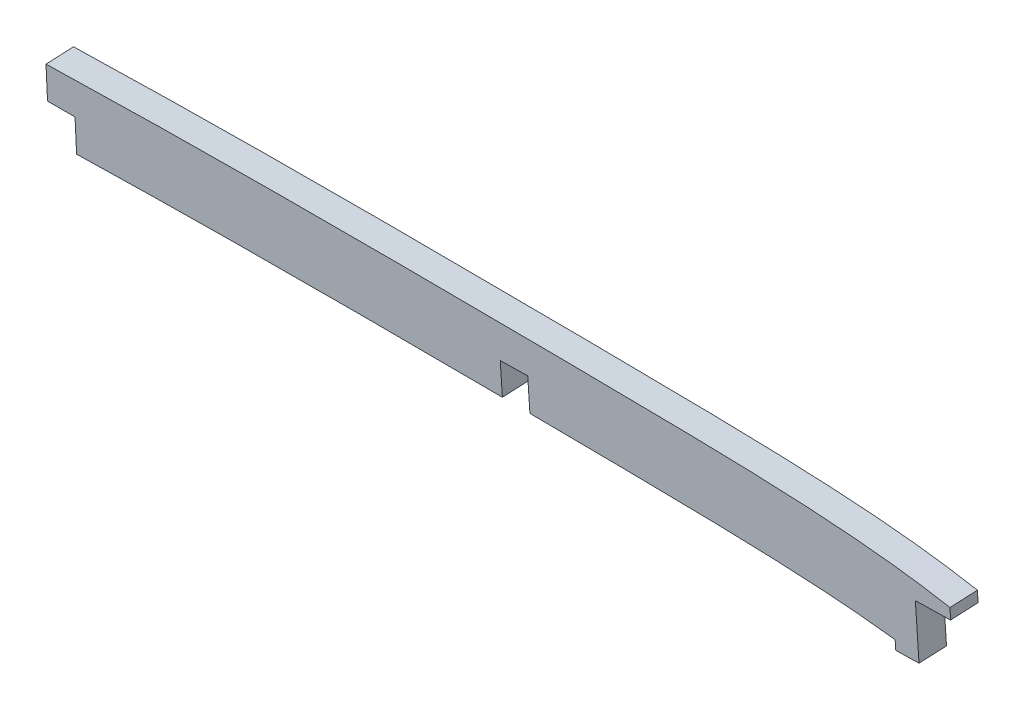
ISO-10303-21;
HEADER;
FILE_DESCRIPTION(('STEP AP214'),'2;1');
FILE_NAME('part.step','',(''),(''),'','','');
FILE_SCHEMA(('AUTOMOTIVE_DESIGN { 1 0 10303 214 1 1 1 1 }'));
ENDSEC;
DATA;
#1=APPLICATION_CONTEXT('core data for automotive mechanical design processes');
#2=APPLICATION_PROTOCOL_DEFINITION('international standard','automotive_design',2000,#1);
#3=PRODUCT_CONTEXT('',#1,'mechanical');
#4=PRODUCT('Part','Part','',(#3));
#5=PRODUCT_RELATED_PRODUCT_CATEGORY('part','',(#4));
#6=PRODUCT_DEFINITION_FORMATION('','',#4);
#7=PRODUCT_DEFINITION_CONTEXT('part definition',#1,'design');
#8=PRODUCT_DEFINITION('design','',#6,#7);
#9=PRODUCT_DEFINITION_SHAPE('','',#8);
#10=(LENGTH_UNIT() NAMED_UNIT(*) SI_UNIT(.MILLI.,.METRE.));
#11=(NAMED_UNIT(*) PLANE_ANGLE_UNIT() SI_UNIT($,.RADIAN.));
#12=(NAMED_UNIT(*) SI_UNIT($,.STERADIAN.) SOLID_ANGLE_UNIT());
#13=UNCERTAINTY_MEASURE_WITH_UNIT(LENGTH_MEASURE(1.E-05),#10,'distance_accuracy_value','');
#14=(GEOMETRIC_REPRESENTATION_CONTEXT(3) GLOBAL_UNCERTAINTY_ASSIGNED_CONTEXT((#13)) GLOBAL_UNIT_ASSIGNED_CONTEXT((#10,
#11,#12)) REPRESENTATION_CONTEXT('',''));
#15=CARTESIAN_POINT('',(0.,0.,0.));
#16=DIRECTION('',(0.,0.,1.));
#17=DIRECTION('',(1.,0.,0.));
#18=AXIS2_PLACEMENT_3D('',#15,#16,#17);
#19=CARTESIAN_POINT('',(369.420487818709,61.2412763168802,-346.422078012425));
#20=CARTESIAN_POINT('',(368.44240568916,61.4320300050019,-346.413164665957));
#21=CARTESIAN_POINT('',(366.486866077233,61.7722987126271,-346.397257008369));
#22=CARTESIAN_POINT('',(362.486782990101,62.3297593061845,-346.371165639694));
#23=CARTESIAN_POINT('',(355.33819907259,63.0165295983064,-346.338938603197));
#24=CARTESIAN_POINT('',(344.775357576126,63.4351211440958,-346.31906275037));
#25=CARTESIAN_POINT('',(331.824438621819,63.6148412933998,-346.310212852813));
#26=CARTESIAN_POINT('',(318.802983299391,63.7288283680356,-346.304419145696));
#27=CARTESIAN_POINT('',(305.794687789378,63.804468488525,-346.300410381191));
#28=CARTESIAN_POINT('',(288.488108246319,63.7992452569213,-346.300002987431));
#29=CARTESIAN_POINT('',(275.548958827054,63.6009343430068,-346.30874493665));
#30=CARTESIAN_POINT('',(266.917257889437,63.3568843264094,-346.319777214006));
#31=B_SPLINE_CURVE_WITH_KNOTS('',3,(#19,#20,#21,#22,#23,#24,#25,#26,#27,#28,#29,#30),
.UNSPECIFIED.,.F.,.F.,(4,1,1,1,1,1,1,1,1,4),(0.,0.0302202493862455,0.0604404987724908,
0.120880997544982,0.241761995089964,0.362642992634945,0.483523990179927,0.604404987724909,
0.725285985269891,0.967047980359854),.UNSPECIFIED.);
#32=DIRECTION('',(3.7543523764589E-05,-0.0464839809289168,0.998919034810872));
#33=VECTOR('',#32,1.);
#34=SURFACE_OF_LINEAR_EXTRUSION('',#31,#33);
#35=CARTESIAN_POINT('',(369.420607019397,61.0936896774308,-343.2505100769));
#36=CARTESIAN_POINT('',(368.442524889848,61.2844433655526,-343.241596730432));
#37=CARTESIAN_POINT('',(366.486985277921,61.6247120731778,-343.225689072844));
#38=CARTESIAN_POINT('',(362.486902190789,62.1821726667352,-343.199597704169));
#39=CARTESIAN_POINT('',(355.338318273278,62.8689429588571,-343.167370667673));
#40=CARTESIAN_POINT('',(344.775476776814,63.2875345046465,-343.147494814846));
#41=CARTESIAN_POINT('',(331.824557822507,63.4672546539505,-343.138644917288));
#42=CARTESIAN_POINT('',(318.803102500079,63.5812417285863,-343.132851210172));
#43=CARTESIAN_POINT('',(305.794806990066,63.6568818490757,-343.128842445667));
#44=CARTESIAN_POINT('',(288.488227447007,63.651658617472,-343.128435051906));
#45=CARTESIAN_POINT('',(275.549078027742,63.4533477035575,-343.137177001126));
#46=CARTESIAN_POINT('',(266.917377090125,63.2092976869601,-343.148209278481));
#47=B_SPLINE_CURVE_WITH_KNOTS('',3,(#35,#36,#37,#38,#39,#40,#41,#42,#43,#44,#45,#46),
.UNSPECIFIED.,.F.,.F.,(4,1,1,1,1,1,1,1,1,4),(0.,0.0302202493862455,0.0604404987724908,
0.120880997544982,0.241761995089964,0.362642992634945,0.483523990179927,0.604404987724909,
0.725285985269891,0.967047980359854),.UNSPECIFIED.);
#48=CARTESIAN_POINT('',(364.250658331424,61.930010134383,-343.211398196056));
#49=VERTEX_POINT('',#48);
#50=CARTESIAN_POINT('',(322.188953932461,63.5488260067344,-343.134486906896));
#51=VERTEX_POINT('',#50);
#52=EDGE_CURVE('E169',#49,#51,#47,.T.);
#53=ORIENTED_EDGE('',*,*,#52,.T.);
#54=DIRECTION('',(-3.75435237647195E-05,0.0464839809289114,-0.998919034810872));
#55=VECTOR('',#54,1.);
#56=CARTESIAN_POINT('',(322.188972537256,63.5257907433447,-342.639469857754));
#57=LINE('',#56,#55);
#58=CARTESIAN_POINT('',(322.188834731773,63.6964126461844,-346.306054842437));
#59=VERTEX_POINT('',#58);
#60=EDGE_CURVE('E327',#51,#59,#57,.T.);
#61=ORIENTED_EDGE('',*,*,#60,.T.);
#62=CARTESIAN_POINT('',(364.250539130736,62.0775967738323,-346.38296613158));
#63=VERTEX_POINT('',#62);
#64=EDGE_CURVE('E141',#63,#59,#31,.T.);
#65=ORIENTED_EDGE('',*,*,#64,.F.);
#66=DIRECTION('',(3.7543523764589E-05,-0.0464839809289168,0.998919034810872));
#67=VECTOR('',#66,1.);
#68=CARTESIAN_POINT('',(364.250539130736,62.0775967738323,-346.38296613158));
#69=LINE('',#68,#67);
#70=EDGE_CURVE('E182',#63,#49,#69,.T.);
#71=ORIENTED_EDGE('',*,*,#70,.T.);
#72=EDGE_LOOP('',(#53,#61,#65,#71));
#73=FACE_BOUND('',#72,.T.);
#74=ADVANCED_FACE('F33',(#73),#34,.F.);
#75=CARTESIAN_POINT('',(266.699880799312,71.0252455411841,-345.962927354164));
#76=CARTESIAN_POINT('',(275.688882980563,71.2793838491713,-345.951439054267));
#77=CARTESIAN_POINT('',(284.67872368024,71.4141313557889,-345.945506551208));
#78=CARTESIAN_POINT('',(302.659729883252,71.4949967987281,-345.942419336663));
#79=CARTESIAN_POINT('',(311.650873909508,71.4495120296195,-345.944873862289));
#80=CARTESIAN_POINT('',(325.137727462551,71.3455825222424,-345.950217039323));
#81=CARTESIAN_POINT('',(329.632952739579,71.3049320735367,-345.952277628027));
#82=CARTESIAN_POINT('',(338.621240842678,71.1905407321223,-345.957938564243));
#83=CARTESIAN_POINT('',(343.114428544064,71.1187107172777,-345.961449995117));
#84=CARTESIAN_POINT('',(349.846717867757,70.8963174700665,-345.972051932768));
#85=CARTESIAN_POINT('',(352.08950535454,70.8021563917662,-345.976517944285));
#86=CARTESIAN_POINT('',(356.570532443114,70.5442411962474,-345.988688258547));
#87=CARTESIAN_POINT('',(358.808776972705,70.3805624856446,-345.996389052486));
#88=CARTESIAN_POINT('',(363.278261116932,69.9460138492462,-346.016778443419));
#89=CARTESIAN_POINT('',(365.509502272778,69.6751675074835,-346.029465943005));
#90=CARTESIAN_POINT('',(369.961608798798,68.9747015794495,-346.062228951284));
#91=CARTESIAN_POINT('',(372.182467437235,68.5449789822166,-346.082309253265));
#92=CARTESIAN_POINT('',(374.395880799313,68.0013266334214,-346.107690914708));
#93=B_SPLINE_CURVE_WITH_KNOTS('',3,(#75,#76,#77,#78,#79,#80,#81,#82,#83,#84,#85,#86,#87,#88,#89,
#90,#91,#92),.UNSPECIFIED.,.F.,.F.,(4,2,2,2,2,2,2,2,4),(0.,0.249999999999999,0.499999999999998,
0.624999999999999,0.749999999999999,0.812499999999999,0.875,0.9375,1.),.UNSPECIFIED.);
#94=DIRECTION('',(3.7543523764589E-05,-0.0464839809289168,0.998919034810872));
#95=VECTOR('',#94,1.);
#96=SURFACE_OF_LINEAR_EXTRUSION('',#93,#95);
#97=CARTESIAN_POINT('',(266.7,70.8776589017347,-342.79135941864));
#98=CARTESIAN_POINT('',(275.689002181251,71.131797209722,-342.779871118743));
#99=CARTESIAN_POINT('',(284.678842880928,71.2665447163396,-342.773938615684));
#100=CARTESIAN_POINT('',(302.65984908394,71.3474101592788,-342.770851401138));
#101=CARTESIAN_POINT('',(311.650993110196,71.3019253901702,-342.773305926764));
#102=CARTESIAN_POINT('',(325.137846663238,71.1979958827931,-342.778649103798));
#103=CARTESIAN_POINT('',(329.633071940267,71.1573454340874,-342.780709692503));
#104=CARTESIAN_POINT('',(338.621360043366,71.042954092673,-342.786370628718));
#105=CARTESIAN_POINT('',(343.114547744752,70.9711240778284,-342.789882059592));
#106=CARTESIAN_POINT('',(349.846837068444,70.7487308306172,-342.800483997244));
#107=CARTESIAN_POINT('',(352.089624555228,70.6545697523169,-342.80495000876));
#108=CARTESIAN_POINT('',(356.570651643802,70.3966545567981,-342.817120323023));
#109=CARTESIAN_POINT('',(358.808896173393,70.2329758461953,-342.824821116962));
#110=CARTESIAN_POINT('',(363.27838031762,69.7984272097969,-342.845210507895));
#111=CARTESIAN_POINT('',(365.509621473466,69.5275808680342,-342.857898007481));
#112=CARTESIAN_POINT('',(368.788080785997,69.0117690761437,-342.882024157422));
#113=CARTESIAN_POINT('',(369.839325788696,68.8284235772094,-342.890595518882));
#114=CARTESIAN_POINT('',(370.889171922773,68.6236721899162,-342.900162935432));
#115=B_SPLINE_CURVE_WITH_KNOTS('',3,(#97,#98,#99,#100,#101,#102,#103,#104,#105,#106,#107,#108,
#109,#110,#111,#112,#113,#114),.UNSPECIFIED.,.F.,.F.,(4,2,2,2,2,2,2,2,4),(0.,0.249999999999999,
0.499999999999998,0.624999999999999,0.749999999999999,0.812499999999999,0.875,0.9375,
0.967047980359709),.UNSPECIFIED.);
#116=CARTESIAN_POINT('',(266.7,70.8776589017347,-342.79135941864));
#117=VERTEX_POINT('',#116);
#118=CARTESIAN_POINT('',(370.889171922773,68.6236721899136,-342.900162935432));
#119=VERTEX_POINT('',#118);
#120=EDGE_CURVE('E242',#117,#119,#115,.T.);
#121=ORIENTED_EDGE('',*,*,#120,.T.);
#122=DIRECTION('',(3.7543523764589E-05,-0.0464839809289168,0.998919034810872));
#123=VECTOR('',#122,1.);
#124=CARTESIAN_POINT('',(370.889052722085,68.7712588293629,-346.071730870957));
#125=LINE('',#124,#123);
#126=CARTESIAN_POINT('',(370.889052722085,68.7712588293629,-346.071730870957));
#127=VERTEX_POINT('',#126);
#128=EDGE_CURVE('E197',#127,#119,#125,.T.);
#129=ORIENTED_EDGE('',*,*,#128,.F.);
#130=CARTESIAN_POINT('',(370.889052722085,68.7712588293655,-346.071730870956));
#131=CARTESIAN_POINT('',(369.839206588008,68.9760102166587,-346.062163454407));
#132=CARTESIAN_POINT('',(368.787961585309,69.159355715593,-346.053592092946));
#133=CARTESIAN_POINT('',(365.509502272778,69.6751675074835,-346.029465943005));
#134=CARTESIAN_POINT('',(363.278261116932,69.9460138492462,-346.016778443419));
#135=CARTESIAN_POINT('',(358.808776972705,70.3805624856446,-345.996389052486));
#136=CARTESIAN_POINT('',(356.570532443114,70.5442411962474,-345.988688258547));
#137=CARTESIAN_POINT('',(352.08950535454,70.8021563917662,-345.976517944284));
#138=CARTESIAN_POINT('',(349.846717867757,70.8963174700665,-345.972051932768));
#139=CARTESIAN_POINT('',(343.114428544064,71.1187107172777,-345.961449995116));
#140=CARTESIAN_POINT('',(338.621240842678,71.1905407321223,-345.957938564242));
#141=CARTESIAN_POINT('',(329.632952739579,71.3049320735367,-345.952277628027));
#142=CARTESIAN_POINT('',(325.137727462551,71.3455825222424,-345.950217039323));
#143=CARTESIAN_POINT('',(311.650873909508,71.4495120296195,-345.944873862288));
#144=CARTESIAN_POINT('',(302.659729883252,71.4949967987281,-345.942419336663));
#145=CARTESIAN_POINT('',(284.67872368024,71.4141313557889,-345.945506551208));
#146=CARTESIAN_POINT('',(275.688882980563,71.2793838491713,-345.951439054267));
#147=CARTESIAN_POINT('',(266.699880799312,71.0252455411841,-345.962927354164));
#148=B_SPLINE_CURVE_WITH_KNOTS('',3,(#130,#131,#132,#133,#134,#135,#136,#137,#138,#139,#140,
#141,#142,#143,#144,#145,#146,#147),.UNSPECIFIED.,.F.,.F.,(4,2,2,2,2,2,2,2,4),(0.,
0.0295479803597086,0.0920479803597088,0.154547980359709,0.217047980359709,0.34204798035971,
0.46704798035971,0.717047980359709,0.967047980359708),.UNSPECIFIED.);
#149=CARTESIAN_POINT('',(266.699880799312,71.0252455411841,-345.962927354164));
#150=VERTEX_POINT('',#149);
#151=EDGE_CURVE('E200',#150,#127,#148,.F.);
#152=ORIENTED_EDGE('',*,*,#151,.F.);
#153=DIRECTION('',(3.7543523764589E-05,-0.0464839809289168,0.998919034810872));
#154=VECTOR('',#153,1.);
#155=CARTESIAN_POINT('',(266.699880799312,71.0252455411841,-345.962927354164));
#156=LINE('',#155,#154);
#157=EDGE_CURVE('E155',#150,#117,#156,.T.);
#158=ORIENTED_EDGE('',*,*,#157,.T.);
#159=EDGE_LOOP('',(#121,#129,#152,#158));
#160=FACE_BOUND('',#159,.T.);
#161=ADVANCED_FACE('F35',(#160),#96,.F.);
#162=CARTESIAN_POINT('',(370.88905268302,67.4845239183994,-346.131608157279));
#163=DIRECTION('',(-0.999999999295241,-1.71487874951869E-06,3.75043502440966E-05));
#164=DIRECTION('',(3.75043502441517E-05,0.,0.999999999296712));
#165=AXIS2_PLACEMENT_3D('',#162,#163,#164);
#166=PLANE('',#165);
#167=DIRECTION('',(-3.03264762106378E-08,-0.998919035514921,-0.0464839809605268));
#168=VECTOR('',#167,1.);
#169=CARTESIAN_POINT('',(370.889171883708,67.3369372789501,-342.960040221755));
#170=LINE('',#169,#168);
#171=CARTESIAN_POINT('',(370.889171883708,67.3369372789501,-342.960040221755));
#172=VERTEX_POINT('',#171);
#173=EDGE_CURVE('E162',#119,#172,#170,.T.);
#174=ORIENTED_EDGE('',*,*,#173,.T.);
#175=DIRECTION('',(3.7543523764589E-05,-0.0464839809289168,0.998919034810872));
#176=VECTOR('',#175,1.);
#177=CARTESIAN_POINT('',(370.88905268302,67.4845239183994,-346.131608157279));
#178=LINE('',#177,#176);
#179=CARTESIAN_POINT('',(370.88905268302,67.4845239183994,-346.131608157279));
#180=VERTEX_POINT('',#179);
#181=EDGE_CURVE('E194',#180,#172,#178,.T.);
#182=ORIENTED_EDGE('',*,*,#181,.F.);
#183=DIRECTION('',(-3.03264762106378E-08,-0.998919035514921,-0.0464839809605268));
#184=VECTOR('',#183,1.);
#185=CARTESIAN_POINT('',(370.88905268302,67.4845239183994,-346.131608157279));
#186=LINE('',#185,#184);
#187=EDGE_CURVE('E107',#127,#180,#186,.T.);
#188=ORIENTED_EDGE('',*,*,#187,.F.);
#189=ORIENTED_EDGE('',*,*,#128,.T.);
#190=EDGE_LOOP('',(#174,#182,#188,#189));
#191=FACE_BOUND('',#190,.T.);
#192=ADVANCED_FACE('F312',(#191),#166,.F.);
#193=CARTESIAN_POINT('',(370.88905268302,67.4845239183994,-346.131608157279));
#194=DIRECTION('',(-0.0207424182938116,0.99870408477937,0.0464747579695279));
#195=DIRECTION('',(0.,-0.0464847590307426,0.998918999307678));
#196=AXIS2_PLACEMENT_3D('',#193,#194,#195);
#197=PLANE('',#196);
#198=DIRECTION('',(-0.999784852192615,-0.0207217412878777,-0.000926695305851987));
#199=VECTOR('',#198,1.);
#200=CARTESIAN_POINT('',(370.889171883708,67.3369372789501,-342.960040221755));
#201=LINE('',#200,#199);
#202=CARTESIAN_POINT('',(366.826046244414,67.2527241223565,-342.963806311477));
#203=VERTEX_POINT('',#202);
#204=EDGE_CURVE('E159',#172,#203,#201,.T.);
#205=ORIENTED_EDGE('',*,*,#204,.T.);
#206=DIRECTION('',(3.7543523764589E-05,-0.0464839809289168,0.998919034810872));
#207=VECTOR('',#206,1.);
#208=CARTESIAN_POINT('',(366.825927043726,67.4003107618058,-346.135374247002));
#209=LINE('',#208,#207);
#210=CARTESIAN_POINT('',(366.825927043726,67.4003107618058,-346.135374247002));
#211=VERTEX_POINT('',#210);
#212=EDGE_CURVE('E191',#211,#203,#209,.T.);
#213=ORIENTED_EDGE('',*,*,#212,.F.);
#214=DIRECTION('',(-0.999784852192615,-0.0207217412878777,-0.000926695305851987));
#215=VECTOR('',#214,1.);
#216=CARTESIAN_POINT('',(370.88905268302,67.4845239183994,-346.131608157279));
#217=LINE('',#216,#215);
#218=EDGE_CURVE('E278',#180,#211,#217,.T.);
#219=ORIENTED_EDGE('',*,*,#218,.F.);
#220=ORIENTED_EDGE('',*,*,#181,.T.);
#221=EDGE_LOOP('',(#205,#213,#219,#220));
#222=FACE_BOUND('',#221,.T.);
#223=ADVANCED_FACE('F309',(#222),#197,.F.);
#224=CARTESIAN_POINT('',(366.957641399891,61.0585398234568,-346.430488960109));
#225=DIRECTION('',(-0.999784852192615,-0.0207217412878619,-0.000926695305847702));
#226=DIRECTION('',(0.0207217501854124,-0.999785281482606,0.));
#227=AXIS2_PLACEMENT_3D('',#224,#225,#226);
#228=PLANE('',#227);
#229=DIRECTION('',(0.0207424182937956,-0.99870408477937,-0.0464747579695281));
#230=VECTOR('',#229,1.);
#231=CARTESIAN_POINT('',(366.957760600579,60.9109531840075,-343.258921024584));
#232=LINE('',#231,#230);
#233=CARTESIAN_POINT('',(366.957760600579,60.9109531840075,-343.258921024584));
#234=VERTEX_POINT('',#233);
#235=EDGE_CURVE('E161',#203,#234,#232,.T.);
#236=ORIENTED_EDGE('',*,*,#235,.T.);
#237=DIRECTION('',(3.7543523764589E-05,-0.0464839809289168,0.998919034810872));
#238=VECTOR('',#237,1.);
#239=CARTESIAN_POINT('',(366.957641399891,61.0585398234568,-346.430488960109));
#240=LINE('',#239,#238);
#241=CARTESIAN_POINT('',(366.957641399891,61.0585398234568,-346.430488960109));
#242=VERTEX_POINT('',#241);
#243=EDGE_CURVE('E188',#242,#234,#240,.T.);
#244=ORIENTED_EDGE('',*,*,#243,.F.);
#245=DIRECTION('',(0.0207424182937956,-0.99870408477937,-0.0464747579695281));
#246=VECTOR('',#245,1.);
#247=CARTESIAN_POINT('',(366.957641399891,61.0585398234568,-346.430488960109));
#248=LINE('',#247,#246);
#249=EDGE_CURVE('E283',#211,#242,#248,.T.);
#250=ORIENTED_EDGE('',*,*,#249,.F.);
#251=ORIENTED_EDGE('',*,*,#212,.T.);
#252=EDGE_LOOP('',(#236,#244,#250,#251));
#253=FACE_BOUND('',#252,.T.);
#254=ADVANCED_FACE('F305',(#253),#228,.F.);
#255=CARTESIAN_POINT('',(366.957641399891,61.0585398234568,-346.430488960109));
#256=DIRECTION('',(-0.0207424182938145,0.99870408477937,0.0464747579695279));
#257=DIRECTION('',(0.,-0.0464847590307426,0.998918999307679));
#258=AXIS2_PLACEMENT_3D('',#255,#256,#257);
#259=PLANE('',#258);
#260=DIRECTION('',(-0.999784852192615,-0.0207217412878809,-0.000926695305848244));
#261=VECTOR('',#260,1.);
#262=CARTESIAN_POINT('',(366.957760600579,60.9109531840075,-343.258921024584));
#263=LINE('',#262,#261);
#264=CARTESIAN_POINT('',(364.272979181361,60.8553078660558,-343.26140953432));
#265=VERTEX_POINT('',#264);
#266=EDGE_CURVE('E164',#234,#265,#263,.T.);
#267=ORIENTED_EDGE('',*,*,#266,.T.);
#268=DIRECTION('',(3.7543523764589E-05,-0.0464839809289168,0.998919034810872));
#269=VECTOR('',#268,1.);
#270=CARTESIAN_POINT('',(364.272859980673,61.0028945055051,-346.432977469844));
#271=LINE('',#270,#269);
#272=CARTESIAN_POINT('',(364.272859980673,61.0028945055051,-346.432977469844));
#273=VERTEX_POINT('',#272);
#274=EDGE_CURVE('E185',#273,#265,#271,.T.);
#275=ORIENTED_EDGE('',*,*,#274,.F.);
#276=DIRECTION('',(-0.999784852192615,-0.0207217412878809,-0.000926695305848244));
#277=VECTOR('',#276,1.);
#278=CARTESIAN_POINT('',(366.957641399891,61.0585398234568,-346.430488960109));
#279=LINE('',#278,#277);
#280=EDGE_CURVE('E285',#242,#273,#279,.T.);
#281=ORIENTED_EDGE('',*,*,#280,.F.);
#282=ORIENTED_EDGE('',*,*,#243,.T.);
#283=EDGE_LOOP('',(#267,#275,#281,#282));
#284=FACE_BOUND('',#283,.T.);
#285=ADVANCED_FACE('F301',(#284),#259,.F.);
#286=CARTESIAN_POINT('',(364.272859980673,61.0028945055051,-346.432977469844));
#287=DIRECTION('',(0.999784852192303,0.0207217413028652,0.00092669530654588));
#288=DIRECTION('',(-0.0207217502004156,0.999785281482295,0.));
#289=AXIS2_PLACEMENT_3D('',#286,#287,#288);
#290=PLANE('',#289);
#291=DIRECTION('',(-0.0207424183088151,0.998704084779059,0.0464747579695087));
#292=VECTOR('',#291,1.);
#293=CARTESIAN_POINT('',(364.272979181361,60.8553078660558,-343.26140953432));
#294=LINE('',#293,#292);
#295=EDGE_CURVE('E166',#265,#49,#294,.T.);
#296=ORIENTED_EDGE('',*,*,#295,.T.);
#297=ORIENTED_EDGE('',*,*,#70,.F.);
#298=DIRECTION('',(-0.0207424183088151,0.998704084779059,0.0464747579695087));
#299=VECTOR('',#298,1.);
#300=CARTESIAN_POINT('',(364.272859980673,61.0028945055051,-346.432977469844));
#301=LINE('',#300,#299);
#302=EDGE_CURVE('E287',#273,#63,#301,.T.);
#303=ORIENTED_EDGE('',*,*,#302,.F.);
#304=ORIENTED_EDGE('',*,*,#274,.T.);
#305=EDGE_LOOP('',(#296,#297,#303,#304));
#306=FACE_BOUND('',#305,.T.);
#307=ADVANCED_FACE('F298',(#306),#290,.F.);
#308=CARTESIAN_POINT('',(319.012642358956,63.7209209385845,-346.304794992132));
#309=VERTEX_POINT('',#308);
#310=CARTESIAN_POINT('',(269.87488068153,63.4361727761114,-346.316198742601));
#311=VERTEX_POINT('',#310);
#312=EDGE_CURVE('E137',#309,#311,#31,.T.);
#313=ORIENTED_EDGE('',*,*,#312,.F.);
#314=DIRECTION('',(-3.75435237647195E-05,0.0464839809289114,-0.998919034810872));
#315=VECTOR('',#314,1.);
#316=CARTESIAN_POINT('',(319.01278016444,63.5502990357447,-342.638210007449));
#317=LINE('',#316,#315);
#318=CARTESIAN_POINT('',(319.012761559644,63.5733342991344,-343.133227056591));
#319=VERTEX_POINT('',#318);
#320=EDGE_CURVE('E262',#319,#309,#317,.T.);
#321=ORIENTED_EDGE('',*,*,#320,.F.);
#322=CARTESIAN_POINT('',(269.874999882218,63.2885861366621,-343.144630807076));
#323=VERTEX_POINT('',#322);
#324=EDGE_CURVE('E168',#319,#323,#47,.T.);
#325=ORIENTED_EDGE('',*,*,#324,.T.);
#326=DIRECTION('',(3.7543523764589E-05,-0.0464839809289168,0.998919034810872));
#327=VECTOR('',#326,1.);
#328=CARTESIAN_POINT('',(269.87488068153,63.4361727761114,-346.316198742601));
#329=LINE('',#328,#327);
#330=EDGE_CURVE('E150',#311,#323,#329,.T.);
#331=ORIENTED_EDGE('',*,*,#330,.F.);
#332=EDGE_LOOP('',(#313,#321,#325,#331));
#333=FACE_BOUND('',#332,.T.);
#334=ADVANCED_FACE('F266',(#333),#34,.F.);
#335=CARTESIAN_POINT('',(269.874880797074,67.2420543014233,-346.139094775141));
#336=DIRECTION('',(0.999999999295242,1.71487878442156E-06,-3.75043502424724E-05));
#337=DIRECTION('',(-3.75043502425275E-05,0.,-0.999999999296712));
#338=AXIS2_PLACEMENT_3D('',#335,#336,#337);
#339=PLANE('',#338);
#340=DIRECTION('',(3.03264412707225E-08,0.99891903551492,0.0464839809605459));
#341=VECTOR('',#340,1.);
#342=CARTESIAN_POINT('',(269.874999997762,67.094467661974,-342.967526839616));
#343=LINE('',#342,#341);
#344=CARTESIAN_POINT('',(269.874999997762,67.094467661974,-342.967526839616));
#345=VERTEX_POINT('',#344);
#346=EDGE_CURVE('E147',#323,#345,#343,.T.);
#347=ORIENTED_EDGE('',*,*,#346,.T.);
#348=DIRECTION('',(3.7543523764589E-05,-0.0464839809289168,0.998919034810872));
#349=VECTOR('',#348,1.);
#350=CARTESIAN_POINT('',(269.874880797074,67.2420543014233,-346.139094775141));
#351=LINE('',#350,#349);
#352=CARTESIAN_POINT('',(269.874880797074,67.2420543014233,-346.139094775141));
#353=VERTEX_POINT('',#352);
#354=EDGE_CURVE('E144',#353,#345,#351,.T.);
#355=ORIENTED_EDGE('',*,*,#354,.F.);
#356=DIRECTION('',(3.03264412707225E-08,0.99891903551492,0.0464839809605459));
#357=VECTOR('',#356,1.);
#358=CARTESIAN_POINT('',(269.874880797074,67.2420543014233,-346.139094775141));
#359=LINE('',#358,#357);
#360=EDGE_CURVE('E128',#311,#353,#359,.T.);
#361=ORIENTED_EDGE('',*,*,#360,.F.);
#362=ORIENTED_EDGE('',*,*,#330,.T.);
#363=EDGE_LOOP('',(#347,#355,#361,#362));
#364=FACE_BOUND('',#363,.T.);
#365=ADVANCED_FACE('F145',(#364),#339,.F.);
#366=CARTESIAN_POINT('',(266.699880799312,67.2420488566832,-346.138975698829));
#367=DIRECTION('',(3.03264523892453E-08,0.998919035514921,0.0464839809605394));
#368=DIRECTION('',(0.,-0.0464839809605394,0.998919035514921));
#369=AXIS2_PLACEMENT_3D('',#366,#367,#368);
#370=PLANE('',#369);
#371=DIRECTION('',(-0.999999999295241,-1.71487877266836E-06,3.75043502290974E-05));
#372=VECTOR('',#371,1.);
#373=CARTESIAN_POINT('',(266.7,67.0944622172339,-342.967407763304));
#374=LINE('',#373,#372);
#375=CARTESIAN_POINT('',(266.7,67.0944622172339,-342.967407763304));
#376=VERTEX_POINT('',#375);
#377=EDGE_CURVE('E178',#345,#376,#374,.T.);
#378=ORIENTED_EDGE('',*,*,#377,.T.);
#379=DIRECTION('',(3.7543523764589E-05,-0.0464839809289168,0.998919034810872));
#380=VECTOR('',#379,1.);
#381=CARTESIAN_POINT('',(266.699880799312,67.2420488566832,-346.138975698829));
#382=LINE('',#381,#380);
#383=CARTESIAN_POINT('',(266.699880799312,67.2420488566832,-346.138975698829));
#384=VERTEX_POINT('',#383);
#385=EDGE_CURVE('E151',#384,#376,#382,.T.);
#386=ORIENTED_EDGE('',*,*,#385,.F.);
#387=DIRECTION('',(-0.999999999295241,-1.71487877266836E-06,3.75043502290974E-05));
#388=VECTOR('',#387,1.);
#389=CARTESIAN_POINT('',(266.699880799312,67.2420488566832,-346.138975698829));
#390=LINE('',#389,#388);
#391=EDGE_CURVE('E133',#353,#384,#390,.T.);
#392=ORIENTED_EDGE('',*,*,#391,.F.);
#393=ORIENTED_EDGE('',*,*,#354,.T.);
#394=EDGE_LOOP('',(#378,#386,#392,#393));
#395=FACE_BOUND('',#394,.T.);
#396=ADVANCED_FACE('F153',(#395),#370,.F.);
#397=CARTESIAN_POINT('',(266.699880799312,71.0252455411841,-345.962927354164));
#398=DIRECTION('',(0.999999999295242,1.74517234141803E-06,-3.7502940553522E-05));
#399=DIRECTION('',(-3.75029405535791E-05,0.,-0.999999999296765));
#400=AXIS2_PLACEMENT_3D('',#397,#398,#399);
#401=PLANE('',#400);
#402=DIRECTION('',(1.02600539149327E-13,0.998919035514868,0.0464839809616833));
#403=VECTOR('',#402,1.);
#404=CARTESIAN_POINT('',(266.7,70.8776589017347,-342.79135941864));
#405=LINE('',#404,#403);
#406=EDGE_CURVE('E98',#376,#117,#405,.T.);
#407=ORIENTED_EDGE('',*,*,#406,.T.);
#408=ORIENTED_EDGE('',*,*,#157,.F.);
#409=DIRECTION('',(1.02600539149327E-13,0.998919035514868,0.0464839809616833));
#410=VECTOR('',#409,1.);
#411=CARTESIAN_POINT('',(266.699880799312,71.0252455411841,-345.962927354164));
#412=LINE('',#411,#410);
#413=EDGE_CURVE('E59',#384,#150,#412,.T.);
#414=ORIENTED_EDGE('',*,*,#413,.F.);
#415=ORIENTED_EDGE('',*,*,#385,.T.);
#416=EDGE_LOOP('',(#407,#408,#414,#415));
#417=FACE_BOUND('',#416,.T.);
#418=ADVANCED_FACE('F217',(#417),#401,.F.);
#419=CARTESIAN_POINT('',(320.642109611537,71.3802256913681,-345.948435980311));
#420=DIRECTION('',(3.7543523775042E-05,-0.0464839809293272,0.998919034810853));
#421=DIRECTION('',(0.,-0.998919035514849,-0.0464839809620872));
#422=AXIS2_PLACEMENT_3D('',#419,#420,#421);
#423=PLANE('',#422);
#424=ORIENTED_EDGE('',*,*,#64,.T.);
#425=DIRECTION('',(0.0207424182949702,-0.998704084779346,-0.0464747579695257));
#426=VECTOR('',#425,1.);
#427=CARTESIAN_POINT('',(322.109789111583,67.5022940359424,-346.128947910418));
#428=LINE('',#427,#426);
#429=CARTESIAN_POINT('',(322.109789111583,67.5022940359424,-346.128947910418));
#430=VERTEX_POINT('',#429);
#431=EDGE_CURVE('E267',#430,#59,#428,.T.);
#432=ORIENTED_EDGE('',*,*,#431,.F.);
#433=DIRECTION('',(0.99978485219259,0.0207217412890451,0.000926695305899691));
#434=VECTOR('',#433,1.);
#435=CARTESIAN_POINT('',(322.109789111583,67.5022940359424,-346.128947910418));
#436=LINE('',#435,#434);
#437=CARTESIAN_POINT('',(318.935472205876,67.4365025073498,-346.131890168015));
#438=VERTEX_POINT('',#437);
#439=EDGE_CURVE('E271',#438,#430,#436,.T.);
#440=ORIENTED_EDGE('',*,*,#439,.F.);
#441=DIRECTION('',(-0.0207424182939614,0.998704084779367,0.0464747579695254));
#442=VECTOR('',#441,1.);
#443=CARTESIAN_POINT('',(318.935472205876,67.4365025073498,-346.131890168015));
#444=LINE('',#443,#442);
#445=EDGE_CURVE('E353',#309,#438,#444,.T.);
#446=ORIENTED_EDGE('',*,*,#445,.F.);
#447=ORIENTED_EDGE('',*,*,#312,.T.);
#448=ORIENTED_EDGE('',*,*,#360,.T.);
#449=ORIENTED_EDGE('',*,*,#391,.T.);
#450=ORIENTED_EDGE('',*,*,#413,.T.);
#451=ORIENTED_EDGE('',*,*,#151,.T.);
#452=ORIENTED_EDGE('',*,*,#187,.T.);
#453=ORIENTED_EDGE('',*,*,#218,.T.);
#454=ORIENTED_EDGE('',*,*,#249,.T.);
#455=ORIENTED_EDGE('',*,*,#280,.T.);
#456=ORIENTED_EDGE('',*,*,#302,.T.);
#457=EDGE_LOOP('',(#424,#432,#440,#446,#447,#448,#449,#450,#451,#452,#453,#454,#455,#456));
#458=FACE_BOUND('',#457,.T.);
#459=ADVANCED_FACE('F131',(#458),#423,.F.);
#460=CARTESIAN_POINT('',(320.642228812224,71.2326390519188,-342.776868044787));
#461=DIRECTION('',(3.7543523775042E-05,-0.0464839809293272,0.998919034810853));
#462=DIRECTION('',(0.,-0.998919035514849,-0.0464839809620872));
#463=AXIS2_PLACEMENT_3D('',#460,#461,#462);
#464=PLANE('',#463);
#465=DIRECTION('',(-0.0207424182949701,0.998704084779327,0.0464747579699374));
#466=VECTOR('',#465,1.);
#467=CARTESIAN_POINT('',(322.028769392825,71.2613767699738,-342.775582867636));
#468=LINE('',#467,#466);
#469=CARTESIAN_POINT('',(322.109908312271,67.3547073964923,-342.957379974876));
#470=VERTEX_POINT('',#469);
#471=EDGE_CURVE('E11',#51,#470,#468,.T.);
#472=ORIENTED_EDGE('',*,*,#471,.F.);
#473=ORIENTED_EDGE('',*,*,#52,.F.);
#474=ORIENTED_EDGE('',*,*,#295,.F.);
#475=ORIENTED_EDGE('',*,*,#266,.F.);
#476=ORIENTED_EDGE('',*,*,#235,.F.);
#477=ORIENTED_EDGE('',*,*,#204,.F.);
#478=ORIENTED_EDGE('',*,*,#173,.F.);
#479=ORIENTED_EDGE('',*,*,#120,.F.);
#480=ORIENTED_EDGE('',*,*,#406,.F.);
#481=ORIENTED_EDGE('',*,*,#377,.F.);
#482=ORIENTED_EDGE('',*,*,#346,.F.);
#483=ORIENTED_EDGE('',*,*,#324,.F.);
#484=DIRECTION('',(0.0207424182939614,-0.998704084779347,-0.0464747579699383));
#485=VECTOR('',#484,1.);
#486=CARTESIAN_POINT('',(318.854452487122,71.195585241383,-342.778525125232));
#487=LINE('',#486,#485);
#488=CARTESIAN_POINT('',(318.935591406563,67.2889158678996,-342.960322232472));
#489=VERTEX_POINT('',#488);
#490=EDGE_CURVE('E245',#489,#319,#487,.T.);
#491=ORIENTED_EDGE('',*,*,#490,.F.);
#492=DIRECTION('',(-0.999784852192591,-0.0207217412890451,-0.00092669530590083));
#493=VECTOR('',#492,1.);
#494=CARTESIAN_POINT('',(320.72336773167,67.3259696784373,-342.958665152026));
#495=LINE('',#494,#493);
#496=EDGE_CURVE('E43',#470,#489,#495,.T.);
#497=ORIENTED_EDGE('',*,*,#496,.F.);
#498=EDGE_LOOP('',(#472,#473,#474,#475,#476,#477,#478,#479,#480,#481,#482,#483,#491,#497));
#499=FACE_BOUND('',#498,.T.);
#500=ADVANCED_FACE('F216',(#499),#464,.T.);
#501=CARTESIAN_POINT('',(322.109926917067,67.3316721331027,-342.462362925735));
#502=DIRECTION('',(0.999784852192591,0.0207217412890352,0.000926695305902059));
#503=DIRECTION('',(-0.0207217501865857,0.999785281482582,0.));
#504=AXIS2_PLACEMENT_3D('',#501,#502,#503);
#505=PLANE('',#504);
#506=ORIENTED_EDGE('',*,*,#471,.T.);
#507=DIRECTION('',(-3.75435237647195E-05,0.0464839809289114,-0.998919034810872));
#508=VECTOR('',#507,1.);
#509=CARTESIAN_POINT('',(322.109926917067,67.3316721331027,-342.462362925735));
#510=LINE('',#509,#508);
#511=EDGE_CURVE('E255',#470,#430,#510,.T.);
#512=ORIENTED_EDGE('',*,*,#511,.T.);
#513=ORIENTED_EDGE('',*,*,#431,.T.);
#514=ORIENTED_EDGE('',*,*,#60,.F.);
#515=EDGE_LOOP('',(#506,#512,#513,#514));
#516=FACE_BOUND('',#515,.T.);
#517=ADVANCED_FACE('F223',(#516),#505,.F.);
#518=CARTESIAN_POINT('',(322.109926917067,67.3316721331027,-342.462362925735));
#519=DIRECTION('',(-0.0207424182949799,0.998704084779346,0.0464747579695214));
#520=DIRECTION('',(0.,-0.0464847590307373,0.998918999307679));
#521=AXIS2_PLACEMENT_3D('',#518,#519,#520);
#522=PLANE('',#521);
#523=ORIENTED_EDGE('',*,*,#496,.T.);
#524=DIRECTION('',(-3.75435237647195E-05,0.0464839809289114,-0.998919034810872));
#525=VECTOR('',#524,1.);
#526=CARTESIAN_POINT('',(318.935610011359,67.2658806045101,-342.465305183331));
#527=LINE('',#526,#525);
#528=EDGE_CURVE('E50',#489,#438,#527,.T.);
#529=ORIENTED_EDGE('',*,*,#528,.T.);
#530=ORIENTED_EDGE('',*,*,#439,.T.);
#531=ORIENTED_EDGE('',*,*,#511,.F.);
#532=EDGE_LOOP('',(#523,#529,#530,#531));
#533=FACE_BOUND('',#532,.T.);
#534=ADVANCED_FACE('F250',(#533),#522,.F.);
#535=CARTESIAN_POINT('',(318.935610011359,67.2658806045101,-342.465305183331));
#536=DIRECTION('',(-0.999784852192612,-0.0207217412880276,-0.000926695305855167));
#537=DIRECTION('',(0.020721750185578,-0.999785281482602,0.));
#538=AXIS2_PLACEMENT_3D('',#535,#536,#537);
#539=PLANE('',#538);
#540=ORIENTED_EDGE('',*,*,#490,.T.);
#541=ORIENTED_EDGE('',*,*,#320,.T.);
#542=ORIENTED_EDGE('',*,*,#445,.T.);
#543=ORIENTED_EDGE('',*,*,#528,.F.);
#544=EDGE_LOOP('',(#540,#541,#542,#543));
#545=FACE_BOUND('',#544,.T.);
#546=ADVANCED_FACE('F218',(#545),#539,.F.);
#547=CLOSED_SHELL('',(#74,#161,#192,#223,#254,#285,#307,#334,#365,#396,#418,#459,#500,#517,#534,#546));
#548=MANIFOLD_SOLID_BREP('B2',#547);
#549=ADVANCED_BREP_SHAPE_REPRESENTATION('',(#18,#548),#14);
#550=SHAPE_DEFINITION_REPRESENTATION(#9,#549);
ENDSEC;
END-ISO-10303-21;
